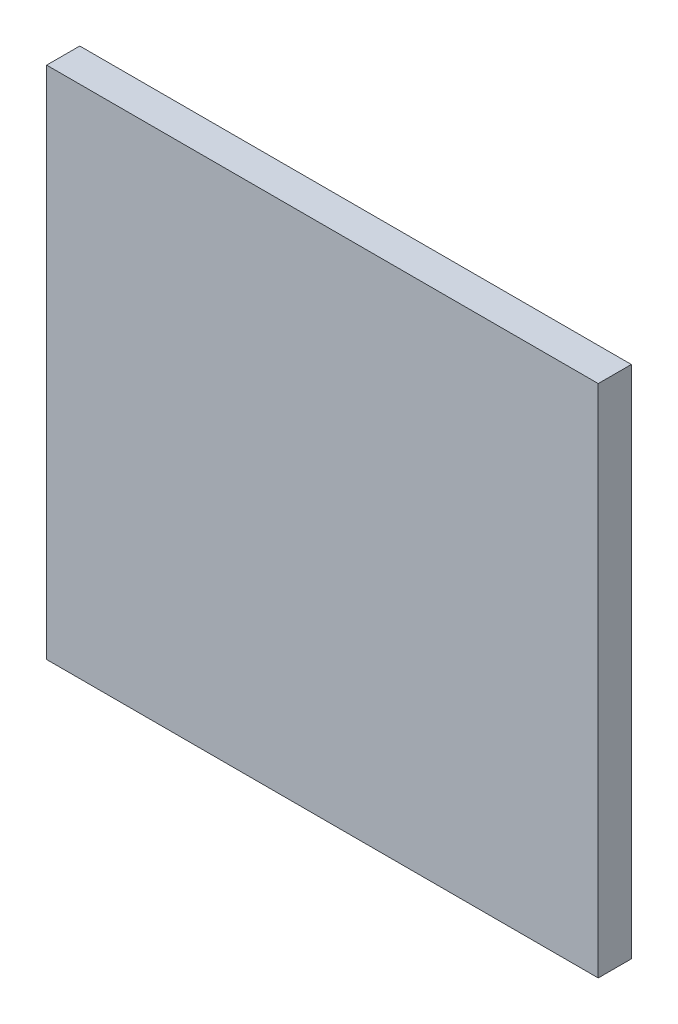
ISO-10303-21;
HEADER;
FILE_DESCRIPTION(('STEP AP214'),'2;1');
FILE_NAME('part.step','',(''),(''),'','','');
FILE_SCHEMA(('AUTOMOTIVE_DESIGN { 1 0 10303 214 1 1 1 1 }'));
ENDSEC;
DATA;
#1=APPLICATION_CONTEXT('core data for automotive mechanical design processes');
#2=APPLICATION_PROTOCOL_DEFINITION('international standard','automotive_design',2000,#1);
#3=PRODUCT_CONTEXT('',#1,'mechanical');
#4=PRODUCT('Part','Part','',(#3));
#5=PRODUCT_RELATED_PRODUCT_CATEGORY('part','',(#4));
#6=PRODUCT_DEFINITION_FORMATION('','',#4);
#7=PRODUCT_DEFINITION_CONTEXT('part definition',#1,'design');
#8=PRODUCT_DEFINITION('design','',#6,#7);
#9=PRODUCT_DEFINITION_SHAPE('','',#8);
#10=(LENGTH_UNIT() NAMED_UNIT(*) SI_UNIT(.MILLI.,.METRE.));
#11=(NAMED_UNIT(*) PLANE_ANGLE_UNIT() SI_UNIT($,.RADIAN.));
#12=(NAMED_UNIT(*) SI_UNIT($,.STERADIAN.) SOLID_ANGLE_UNIT());
#13=UNCERTAINTY_MEASURE_WITH_UNIT(LENGTH_MEASURE(1.E-05),#10,'distance_accuracy_value','');
#14=(GEOMETRIC_REPRESENTATION_CONTEXT(3) GLOBAL_UNCERTAINTY_ASSIGNED_CONTEXT((#13)) GLOBAL_UNIT_ASSIGNED_CONTEXT((#10,
#11,#12)) REPRESENTATION_CONTEXT('',''));
#15=CARTESIAN_POINT('',(0.,0.,0.));
#16=DIRECTION('',(0.,0.,1.));
#17=DIRECTION('',(1.,0.,0.));
#18=AXIS2_PLACEMENT_3D('',#15,#16,#17);
#19=CARTESIAN_POINT('',(15.,-14.,1.8));
#20=DIRECTION('',(-1.,0.,0.));
#21=DIRECTION('',(0.,0.,1.));
#22=AXIS2_PLACEMENT_3D('',#19,#20,#21);
#23=PLANE('',#22);
#24=DIRECTION('',(0.,1.,0.));
#25=VECTOR('',#24,1.);
#26=CARTESIAN_POINT('',(15.,-14.,0.));
#27=LINE('',#26,#25);
#28=CARTESIAN_POINT('',(15.,-14.,0.));
#29=VERTEX_POINT('',#28);
#30=CARTESIAN_POINT('',(15.,14.,0.));
#31=VERTEX_POINT('',#30);
#32=EDGE_CURVE('E96',#29,#31,#27,.T.);
#33=ORIENTED_EDGE('',*,*,#32,.T.);
#34=DIRECTION('',(0.,0.,-1.));
#35=VECTOR('',#34,1.);
#36=CARTESIAN_POINT('',(15.,14.,1.8));
#37=LINE('',#36,#35);
#38=CARTESIAN_POINT('',(15.,14.,1.8));
#39=VERTEX_POINT('',#38);
#40=EDGE_CURVE('E11',#39,#31,#37,.T.);
#41=ORIENTED_EDGE('',*,*,#40,.F.);
#42=DIRECTION('',(0.,1.,0.));
#43=VECTOR('',#42,1.);
#44=CARTESIAN_POINT('',(15.,-14.,1.8));
#45=LINE('',#44,#43);
#46=CARTESIAN_POINT('',(15.,-14.,1.8));
#47=VERTEX_POINT('',#46);
#48=EDGE_CURVE('E84',#47,#39,#45,.T.);
#49=ORIENTED_EDGE('',*,*,#48,.F.);
#50=DIRECTION('',(0.,0.,-1.));
#51=VECTOR('',#50,1.);
#52=CARTESIAN_POINT('',(15.,-14.,1.8));
#53=LINE('',#52,#51);
#54=EDGE_CURVE('E92',#47,#29,#53,.T.);
#55=ORIENTED_EDGE('',*,*,#54,.T.);
#56=EDGE_LOOP('',(#33,#41,#49,#55));
#57=FACE_BOUND('',#56,.T.);
#58=ADVANCED_FACE('F33',(#57),#23,.F.);
#59=CARTESIAN_POINT('',(-15.,14.,1.8));
#60=DIRECTION('',(0.,-1.,0.));
#61=DIRECTION('',(0.,0.,-1.));
#62=AXIS2_PLACEMENT_3D('',#59,#60,#61);
#63=PLANE('',#62);
#64=DIRECTION('',(-1.,0.,0.));
#65=VECTOR('',#64,1.);
#66=CARTESIAN_POINT('',(-15.,14.,0.));
#67=LINE('',#66,#65);
#68=CARTESIAN_POINT('',(-15.,14.,0.));
#69=VERTEX_POINT('',#68);
#70=EDGE_CURVE('E88',#31,#69,#67,.T.);
#71=ORIENTED_EDGE('',*,*,#70,.T.);
#72=DIRECTION('',(0.,0.,-1.));
#73=VECTOR('',#72,1.);
#74=CARTESIAN_POINT('',(-15.,14.,1.8));
#75=LINE('',#74,#73);
#76=CARTESIAN_POINT('',(-15.,14.,1.8));
#77=VERTEX_POINT('',#76);
#78=EDGE_CURVE('E41',#77,#69,#75,.T.);
#79=ORIENTED_EDGE('',*,*,#78,.F.);
#80=DIRECTION('',(-1.,0.,0.));
#81=VECTOR('',#80,1.);
#82=CARTESIAN_POINT('',(-15.,14.,1.8));
#83=LINE('',#82,#81);
#84=EDGE_CURVE('E79',#39,#77,#83,.T.);
#85=ORIENTED_EDGE('',*,*,#84,.F.);
#86=ORIENTED_EDGE('',*,*,#40,.T.);
#87=EDGE_LOOP('',(#71,#79,#85,#86));
#88=FACE_BOUND('',#87,.T.);
#89=ADVANCED_FACE('F87',(#88),#63,.F.);
#90=CARTESIAN_POINT('',(-15.,-14.,1.8));
#91=DIRECTION('',(1.,0.,0.));
#92=DIRECTION('',(0.,0.,-1.));
#93=AXIS2_PLACEMENT_3D('',#90,#91,#92);
#94=PLANE('',#93);
#95=DIRECTION('',(0.,-1.,0.));
#96=VECTOR('',#95,1.);
#97=CARTESIAN_POINT('',(-15.,-14.,0.));
#98=LINE('',#97,#96);
#99=CARTESIAN_POINT('',(-15.,-14.,0.));
#100=VERTEX_POINT('',#99);
#101=EDGE_CURVE('E66',#69,#100,#98,.T.);
#102=ORIENTED_EDGE('',*,*,#101,.T.);
#103=DIRECTION('',(0.,0.,-1.));
#104=VECTOR('',#103,1.);
#105=CARTESIAN_POINT('',(-15.,-14.,1.8));
#106=LINE('',#105,#104);
#107=CARTESIAN_POINT('',(-15.,-14.,1.8));
#108=VERTEX_POINT('',#107);
#109=EDGE_CURVE('E89',#108,#100,#106,.T.);
#110=ORIENTED_EDGE('',*,*,#109,.F.);
#111=DIRECTION('',(0.,-1.,0.));
#112=VECTOR('',#111,1.);
#113=CARTESIAN_POINT('',(-15.,-14.,1.8));
#114=LINE('',#113,#112);
#115=EDGE_CURVE('E82',#77,#108,#114,.T.);
#116=ORIENTED_EDGE('',*,*,#115,.F.);
#117=ORIENTED_EDGE('',*,*,#78,.T.);
#118=EDGE_LOOP('',(#102,#110,#116,#117));
#119=FACE_BOUND('',#118,.T.);
#120=ADVANCED_FACE('F90',(#119),#94,.F.);
#121=CARTESIAN_POINT('',(-15.,-14.,1.8));
#122=DIRECTION('',(0.,1.,0.));
#123=DIRECTION('',(0.,0.,1.));
#124=AXIS2_PLACEMENT_3D('',#121,#122,#123);
#125=PLANE('',#124);
#126=DIRECTION('',(1.,0.,0.));
#127=VECTOR('',#126,1.);
#128=CARTESIAN_POINT('',(-15.,-14.,0.));
#129=LINE('',#128,#127);
#130=EDGE_CURVE('E72',#100,#29,#129,.T.);
#131=ORIENTED_EDGE('',*,*,#130,.T.);
#132=ORIENTED_EDGE('',*,*,#54,.F.);
#133=DIRECTION('',(1.,0.,0.));
#134=VECTOR('',#133,1.);
#135=CARTESIAN_POINT('',(-15.,-14.,1.8));
#136=LINE('',#135,#134);
#137=EDGE_CURVE('E49',#108,#47,#136,.T.);
#138=ORIENTED_EDGE('',*,*,#137,.F.);
#139=ORIENTED_EDGE('',*,*,#109,.T.);
#140=EDGE_LOOP('',(#131,#132,#138,#139));
#141=FACE_BOUND('',#140,.T.);
#142=ADVANCED_FACE('F103',(#141),#125,.F.);
#143=CARTESIAN_POINT('',(0.,0.,1.8));
#144=DIRECTION('',(0.,0.,-1.));
#145=DIRECTION('',(-1.,0.,0.));
#146=AXIS2_PLACEMENT_3D('',#143,#144,#145);
#147=PLANE('',#146);
#148=ORIENTED_EDGE('',*,*,#48,.T.);
#149=ORIENTED_EDGE('',*,*,#84,.T.);
#150=ORIENTED_EDGE('',*,*,#115,.T.);
#151=ORIENTED_EDGE('',*,*,#137,.T.);
#152=EDGE_LOOP('',(#148,#149,#150,#151));
#153=FACE_BOUND('',#152,.T.);
#154=ADVANCED_FACE('F80',(#153),#147,.F.);
#155=CARTESIAN_POINT('',(0.,0.,0.));
#156=DIRECTION('',(0.,0.,-1.));
#157=DIRECTION('',(-1.,0.,0.));
#158=AXIS2_PLACEMENT_3D('',#155,#156,#157);
#159=PLANE('',#158);
#160=ORIENTED_EDGE('',*,*,#32,.F.);
#161=ORIENTED_EDGE('',*,*,#130,.F.);
#162=ORIENTED_EDGE('',*,*,#101,.F.);
#163=ORIENTED_EDGE('',*,*,#70,.F.);
#164=EDGE_LOOP('',(#160,#161,#162,#163));
#165=FACE_BOUND('',#164,.T.);
#166=ADVANCED_FACE('F106',(#165),#159,.T.);
#167=CLOSED_SHELL('',(#58,#89,#120,#142,#154,#166));
#168=MANIFOLD_SOLID_BREP('B2',#167);
#169=ADVANCED_BREP_SHAPE_REPRESENTATION('',(#18,#168),#14);
#170=SHAPE_DEFINITION_REPRESENTATION(#9,#169);
ENDSEC;
END-ISO-10303-21;
